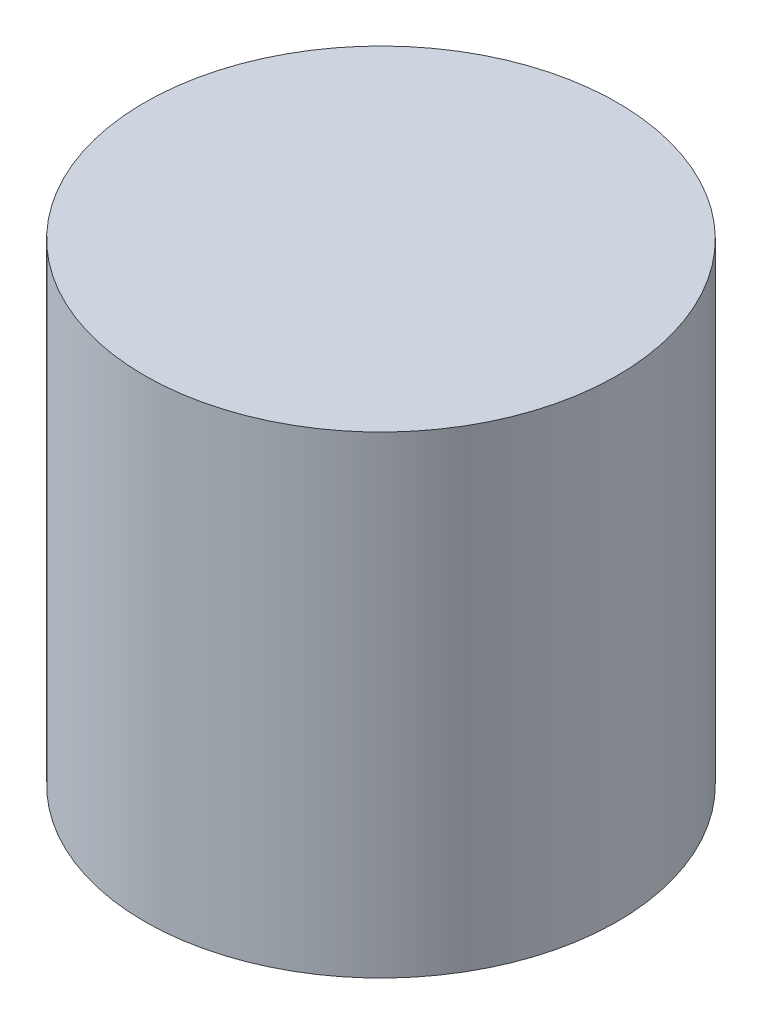
ISO-10303-21;
HEADER;
FILE_DESCRIPTION(('STEP AP214'),'2;1');
FILE_NAME('part.step','',(''),(''),'','','');
FILE_SCHEMA(('AUTOMOTIVE_DESIGN { 1 0 10303 214 1 1 1 1 }'));
ENDSEC;
DATA;
#1=APPLICATION_CONTEXT('core data for automotive mechanical design processes');
#2=APPLICATION_PROTOCOL_DEFINITION('international standard','automotive_design',2000,#1);
#3=PRODUCT_CONTEXT('',#1,'mechanical');
#4=PRODUCT('Part','Part','',(#3));
#5=PRODUCT_RELATED_PRODUCT_CATEGORY('part','',(#4));
#6=PRODUCT_DEFINITION_FORMATION('','',#4);
#7=PRODUCT_DEFINITION_CONTEXT('part definition',#1,'design');
#8=PRODUCT_DEFINITION('design','',#6,#7);
#9=PRODUCT_DEFINITION_SHAPE('','',#8);
#10=(LENGTH_UNIT() NAMED_UNIT(*) SI_UNIT(.MILLI.,.METRE.));
#11=(NAMED_UNIT(*) PLANE_ANGLE_UNIT() SI_UNIT($,.RADIAN.));
#12=(NAMED_UNIT(*) SI_UNIT($,.STERADIAN.) SOLID_ANGLE_UNIT());
#13=UNCERTAINTY_MEASURE_WITH_UNIT(LENGTH_MEASURE(1.E-05),#10,'distance_accuracy_value','');
#14=(GEOMETRIC_REPRESENTATION_CONTEXT(3) GLOBAL_UNCERTAINTY_ASSIGNED_CONTEXT((#13)) GLOBAL_UNIT_ASSIGNED_CONTEXT((#10,
#11,#12)) REPRESENTATION_CONTEXT('',''));
#15=CARTESIAN_POINT('',(0.,0.,0.));
#16=DIRECTION('',(0.,0.,1.));
#17=DIRECTION('',(1.,0.,0.));
#18=AXIS2_PLACEMENT_3D('',#15,#16,#17);
#19=CARTESIAN_POINT('',(0.,63.,0.));
#20=DIRECTION('',(0.,-1.,0.));
#21=DIRECTION('',(0.,0.,-1.));
#22=AXIS2_PLACEMENT_3D('',#19,#20,#21);
#23=CYLINDRICAL_SURFACE('',#22,31.5);
#24=CARTESIAN_POINT('',(0.,63.,0.));
#25=DIRECTION('',(0.,1.,0.));
#26=DIRECTION('',(0.,0.,1.));
#27=AXIS2_PLACEMENT_3D('',#24,#25,#26);
#28=CIRCLE('',#27,31.5);
#29=CARTESIAN_POINT('',(0.,63.,31.5));
#30=VERTEX_POINT('',#29);
#31=EDGE_CURVE('E10',#30,#30,#28,.T.);
#32=ORIENTED_EDGE('',*,*,#31,.F.);
#33=EDGE_LOOP('',(#32));
#34=FACE_BOUND('',#33,.T.);
#35=CARTESIAN_POINT('',(0.,0.,0.));
#36=DIRECTION('',(0.,1.,0.));
#37=DIRECTION('',(0.,0.,1.));
#38=AXIS2_PLACEMENT_3D('',#35,#36,#37);
#39=CIRCLE('',#38,31.5);
#40=CARTESIAN_POINT('',(0.,0.,31.5));
#41=VERTEX_POINT('',#40);
#42=EDGE_CURVE('E40',#41,#41,#39,.T.);
#43=ORIENTED_EDGE('',*,*,#42,.T.);
#44=EDGE_LOOP('',(#43));
#45=FACE_BOUND('',#44,.T.);
#46=ADVANCED_FACE('F37',(#34,#45),#23,.T.);
#47=CARTESIAN_POINT('',(0.,63.,0.));
#48=DIRECTION('',(0.,1.,0.));
#49=DIRECTION('',(0.,0.,1.));
#50=AXIS2_PLACEMENT_3D('',#47,#48,#49);
#51=PLANE('',#50);
#52=ORIENTED_EDGE('',*,*,#31,.T.);
#53=EDGE_LOOP('',(#52));
#54=FACE_BOUND('',#53,.T.);
#55=ADVANCED_FACE('F54',(#54),#51,.T.);
#56=CARTESIAN_POINT('',(0.,0.,0.));
#57=DIRECTION('',(0.,1.,0.));
#58=DIRECTION('',(0.,0.,1.));
#59=AXIS2_PLACEMENT_3D('',#56,#57,#58);
#60=PLANE('',#59);
#61=ORIENTED_EDGE('',*,*,#42,.F.);
#62=EDGE_LOOP('',(#61));
#63=FACE_BOUND('',#62,.T.);
#64=ADVANCED_FACE('F52',(#63),#60,.F.);
#65=CLOSED_SHELL('',(#46,#55,#64));
#66=MANIFOLD_SOLID_BREP('B2',#65);
#67=ADVANCED_BREP_SHAPE_REPRESENTATION('',(#18,#66),#14);
#68=SHAPE_DEFINITION_REPRESENTATION(#9,#67);
ENDSEC;
END-ISO-10303-21;
